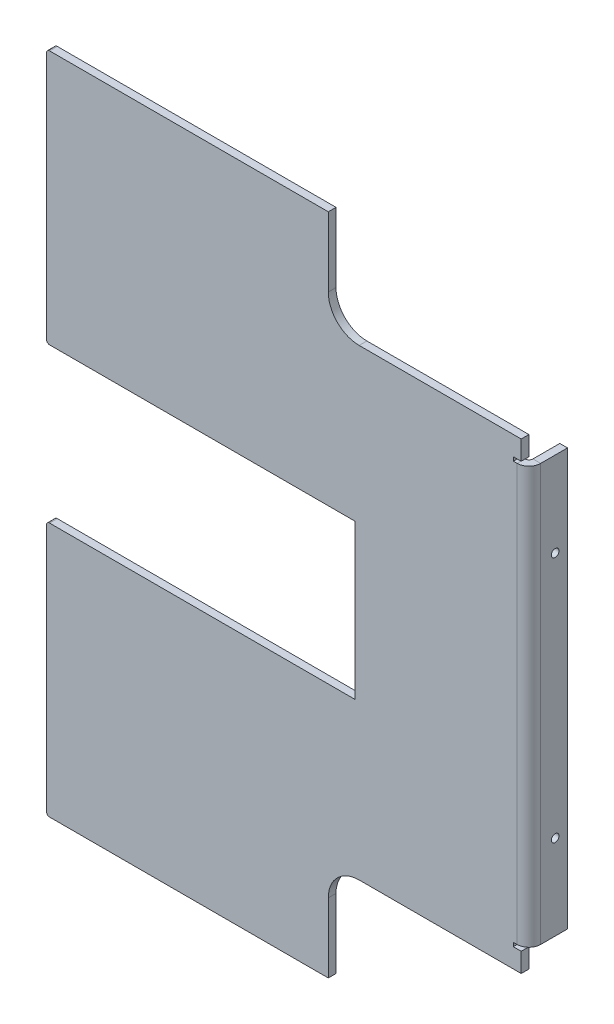
ISO-10303-21;
HEADER;
FILE_DESCRIPTION(('STEP AP214'),'2;1');
FILE_NAME('part.step','',(''),(''),'','','');
FILE_SCHEMA(('AUTOMOTIVE_DESIGN { 1 0 10303 214 1 1 1 1 }'));
ENDSEC;
DATA;
#1=APPLICATION_CONTEXT('core data for automotive mechanical design processes');
#2=APPLICATION_PROTOCOL_DEFINITION('international standard','automotive_design',2000,#1);
#3=PRODUCT_CONTEXT('',#1,'mechanical');
#4=PRODUCT('Part','Part','',(#3));
#5=PRODUCT_RELATED_PRODUCT_CATEGORY('part','',(#4));
#6=PRODUCT_DEFINITION_FORMATION('','',#4);
#7=PRODUCT_DEFINITION_CONTEXT('part definition',#1,'design');
#8=PRODUCT_DEFINITION('design','',#6,#7);
#9=PRODUCT_DEFINITION_SHAPE('','',#8);
#10=(LENGTH_UNIT() NAMED_UNIT(*) SI_UNIT(.MILLI.,.METRE.));
#11=(NAMED_UNIT(*) PLANE_ANGLE_UNIT() SI_UNIT($,.RADIAN.));
#12=(NAMED_UNIT(*) SI_UNIT($,.STERADIAN.) SOLID_ANGLE_UNIT());
#13=UNCERTAINTY_MEASURE_WITH_UNIT(LENGTH_MEASURE(1.E-05),#10,'distance_accuracy_value','');
#14=(GEOMETRIC_REPRESENTATION_CONTEXT(3) GLOBAL_UNCERTAINTY_ASSIGNED_CONTEXT((#13)) GLOBAL_UNIT_ASSIGNED_CONTEXT((#10,
#11,#12)) REPRESENTATION_CONTEXT('',''));
#15=CARTESIAN_POINT('',(0.,0.,0.));
#16=DIRECTION('',(0.,0.,1.));
#17=DIRECTION('',(1.,0.,0.));
#18=AXIS2_PLACEMENT_3D('',#15,#16,#17);
#19=CARTESIAN_POINT('',(153.8,150.,-5.));
#20=DIRECTION('',(1.,0.,0.));
#21=DIRECTION('',(0.,1.,0.));
#22=AXIS2_PLACEMENT_3D('',#19,#20,#21);
#23=PLANE('',#22);
#24=DIRECTION('',(0.,1.,0.));
#25=VECTOR('',#24,1.);
#26=CARTESIAN_POINT('',(153.8,150.,-5.));
#27=LINE('',#26,#25);
#28=CARTESIAN_POINT('',(153.8,-150.,-5.));
#29=VERTEX_POINT('',#28);
#30=CARTESIAN_POINT('',(153.8,-137.5,-5.));
#31=VERTEX_POINT('',#30);
#32=EDGE_CURVE('E356',#29,#31,#27,.T.);
#33=ORIENTED_EDGE('',*,*,#32,.T.);
#34=DIRECTION('',(0.,0.,1.));
#35=VECTOR('',#34,1.);
#36=CARTESIAN_POINT('',(153.8,-137.5,-5.00000000000001));
#37=LINE('',#36,#35);
#38=CARTESIAN_POINT('',(153.8,-137.5,0.));
#39=VERTEX_POINT('',#38);
#40=EDGE_CURVE('E313',#31,#39,#37,.T.);
#41=ORIENTED_EDGE('',*,*,#40,.T.);
#42=DIRECTION('',(0.,1.,0.));
#43=VECTOR('',#42,1.);
#44=CARTESIAN_POINT('',(153.8,150.,0.));
#45=LINE('',#44,#43);
#46=CARTESIAN_POINT('',(153.8,-150.,0.));
#47=VERTEX_POINT('',#46);
#48=EDGE_CURVE('E388',#47,#39,#45,.T.);
#49=ORIENTED_EDGE('',*,*,#48,.F.);
#50=DIRECTION('',(0.,0.,1.));
#51=VECTOR('',#50,1.);
#52=CARTESIAN_POINT('',(153.8,-150.,-5.));
#53=LINE('',#52,#51);
#54=EDGE_CURVE('E421',#29,#47,#53,.T.);
#55=ORIENTED_EDGE('',*,*,#54,.F.);
#56=EDGE_LOOP('',(#33,#41,#49,#55));
#57=FACE_BOUND('',#56,.T.);
#58=ADVANCED_FACE('F43',(#57),#23,.T.);
#59=CARTESIAN_POINT('',(153.8,137.5,0.));
#60=VERTEX_POINT('',#59);
#61=CARTESIAN_POINT('',(153.8,150.,0.));
#62=VERTEX_POINT('',#61);
#63=EDGE_CURVE('E387',#60,#62,#45,.T.);
#64=ORIENTED_EDGE('',*,*,#63,.F.);
#65=DIRECTION('',(0.,0.,1.));
#66=VECTOR('',#65,1.);
#67=CARTESIAN_POINT('',(153.8,137.5,-5.00000000000001));
#68=LINE('',#67,#66);
#69=CARTESIAN_POINT('',(153.8,137.5,-5.));
#70=VERTEX_POINT('',#69);
#71=EDGE_CURVE('E332',#70,#60,#68,.T.);
#72=ORIENTED_EDGE('',*,*,#71,.F.);
#73=CARTESIAN_POINT('',(153.8,150.,-5.));
#74=VERTEX_POINT('',#73);
#75=EDGE_CURVE('E355',#70,#74,#27,.T.);
#76=ORIENTED_EDGE('',*,*,#75,.T.);
#77=DIRECTION('',(0.,0.,1.));
#78=VECTOR('',#77,1.);
#79=CARTESIAN_POINT('',(153.8,150.,-5.));
#80=LINE('',#79,#78);
#81=EDGE_CURVE('E418',#74,#62,#80,.T.);
#82=ORIENTED_EDGE('',*,*,#81,.T.);
#83=EDGE_LOOP('',(#64,#72,#76,#82));
#84=FACE_BOUND('',#83,.T.);
#85=ADVANCED_FACE('F552',(#84),#23,.T.);
#86=CARTESIAN_POINT('',(0.,0.,-5.));
#87=DIRECTION('',(0.,0.,-1.));
#88=DIRECTION('',(-1.,0.,0.));
#89=AXIS2_PLACEMENT_3D('',#86,#87,#88);
#90=PLANE('',#89);
#91=DIRECTION('',(0.,-1.,0.));
#92=VECTOR('',#91,1.);
#93=CARTESIAN_POINT('',(-153.8,215.,-5.));
#94=LINE('',#93,#92);
#95=CARTESIAN_POINT('',(-153.8,213.,-5.));
#96=VERTEX_POINT('',#95);
#97=CARTESIAN_POINT('',(-153.8,51.9999999999999,-5.));
#98=VERTEX_POINT('',#97);
#99=EDGE_CURVE('E367',#96,#98,#94,.T.);
#100=ORIENTED_EDGE('',*,*,#99,.F.);
#101=CARTESIAN_POINT('',(-151.8,213.,-5.));
#102=DIRECTION('',(0.,0.,-1.));
#103=DIRECTION('',(-1.,0.,0.));
#104=AXIS2_PLACEMENT_3D('',#101,#102,#103);
#105=CIRCLE('',#104,2.);
#106=CARTESIAN_POINT('',(-151.8,215.,-5.));
#107=VERTEX_POINT('',#106);
#108=EDGE_CURVE('E490',#96,#107,#105,.T.);
#109=ORIENTED_EDGE('',*,*,#108,.T.);
#110=DIRECTION('',(-1.,0.,0.));
#111=VECTOR('',#110,1.);
#112=CARTESIAN_POINT('',(28.8,215.,-5.));
#113=LINE('',#112,#111);
#114=CARTESIAN_POINT('',(28.8,215.,-5.));
#115=VERTEX_POINT('',#114);
#116=EDGE_CURVE('E364',#115,#107,#113,.T.);
#117=ORIENTED_EDGE('',*,*,#116,.F.);
#118=DIRECTION('',(0.,1.,0.));
#119=VECTOR('',#118,1.);
#120=CARTESIAN_POINT('',(28.8,215.,-5.));
#121=LINE('',#120,#119);
#122=CARTESIAN_POINT('',(28.8,170.,-5.));
#123=VERTEX_POINT('',#122);
#124=EDGE_CURVE('E362',#123,#115,#121,.T.);
#125=ORIENTED_EDGE('',*,*,#124,.F.);
#126=CARTESIAN_POINT('',(48.8,170.,-5.));
#127=DIRECTION('',(0.,0.,-1.));
#128=DIRECTION('',(-1.,0.,0.));
#129=AXIS2_PLACEMENT_3D('',#126,#127,#128);
#130=CIRCLE('',#129,20.);
#131=CARTESIAN_POINT('',(48.8,150.,-5.));
#132=VERTEX_POINT('',#131);
#133=EDGE_CURVE('E463',#123,#132,#130,.F.);
#134=ORIENTED_EDGE('',*,*,#133,.T.);
#135=DIRECTION('',(-1.,0.,0.));
#136=VECTOR('',#135,1.);
#137=CARTESIAN_POINT('',(153.8,150.,-5.));
#138=LINE('',#137,#136);
#139=EDGE_CURVE('E359',#74,#132,#138,.T.);
#140=ORIENTED_EDGE('',*,*,#139,.F.);
#141=ORIENTED_EDGE('',*,*,#75,.F.);
#142=DIRECTION('',(1.,0.,0.));
#143=VECTOR('',#142,1.);
#144=CARTESIAN_POINT('',(148.7,137.5,-5.00000000000001));
#145=LINE('',#144,#143);
#146=CARTESIAN_POINT('',(148.7,137.5,-5.));
#147=VERTEX_POINT('',#146);
#148=EDGE_CURVE('E329',#147,#70,#145,.T.);
#149=ORIENTED_EDGE('',*,*,#148,.F.);
#150=DIRECTION('',(0.,1.,0.));
#151=VECTOR('',#150,1.);
#152=CARTESIAN_POINT('',(148.7,135.,-5.00000000000001));
#153=LINE('',#152,#151);
#154=CARTESIAN_POINT('',(148.7,135.,-5.));
#155=VERTEX_POINT('',#154);
#156=EDGE_CURVE('E325',#155,#147,#153,.T.);
#157=ORIENTED_EDGE('',*,*,#156,.F.);
#158=DIRECTION('',(-1.,0.,0.));
#159=VECTOR('',#158,1.);
#160=CARTESIAN_POINT('',(151.2,135.,-5.00000000000001));
#161=LINE('',#160,#159);
#162=CARTESIAN_POINT('',(151.2,135.,-5.));
#163=VERTEX_POINT('',#162);
#164=EDGE_CURVE('E322',#163,#155,#161,.T.);
#165=ORIENTED_EDGE('',*,*,#164,.F.);
#166=DIRECTION('',(0.,-1.,0.));
#167=VECTOR('',#166,1.);
#168=CARTESIAN_POINT('',(151.2,-135.,-5.00000000000001));
#169=LINE('',#168,#167);
#170=CARTESIAN_POINT('',(151.2,-135.,-5.));
#171=VERTEX_POINT('',#170);
#172=EDGE_CURVE('E300',#171,#163,#169,.F.);
#173=ORIENTED_EDGE('',*,*,#172,.F.);
#174=DIRECTION('',(1.,0.,0.));
#175=VECTOR('',#174,1.);
#176=CARTESIAN_POINT('',(148.7,-135.,-5.00000000000001));
#177=LINE('',#176,#175);
#178=CARTESIAN_POINT('',(148.7,-135.,-5.));
#179=VERTEX_POINT('',#178);
#180=EDGE_CURVE('E318',#179,#171,#177,.T.);
#181=ORIENTED_EDGE('',*,*,#180,.F.);
#182=DIRECTION('',(0.,1.,0.));
#183=VECTOR('',#182,1.);
#184=CARTESIAN_POINT('',(148.7,-137.5,-5.00000000000001));
#185=LINE('',#184,#183);
#186=CARTESIAN_POINT('',(148.7,-137.5,-5.));
#187=VERTEX_POINT('',#186);
#188=EDGE_CURVE('E314',#187,#179,#185,.T.);
#189=ORIENTED_EDGE('',*,*,#188,.F.);
#190=DIRECTION('',(-1.,0.,0.));
#191=VECTOR('',#190,1.);
#192=CARTESIAN_POINT('',(153.8,-137.5,-5.00000000000001));
#193=LINE('',#192,#191);
#194=EDGE_CURVE('E309',#31,#187,#193,.T.);
#195=ORIENTED_EDGE('',*,*,#194,.F.);
#196=ORIENTED_EDGE('',*,*,#32,.F.);
#197=DIRECTION('',(1.,0.,0.));
#198=VECTOR('',#197,1.);
#199=CARTESIAN_POINT('',(153.8,-150.,-5.));
#200=LINE('',#199,#198);
#201=CARTESIAN_POINT('',(48.8000000000001,-150.,-5.));
#202=VERTEX_POINT('',#201);
#203=EDGE_CURVE('E353',#202,#29,#200,.T.);
#204=ORIENTED_EDGE('',*,*,#203,.F.);
#205=CARTESIAN_POINT('',(48.8000000000001,-170.,-5.));
#206=DIRECTION('',(0.,0.,-1.));
#207=DIRECTION('',(-1.,0.,0.));
#208=AXIS2_PLACEMENT_3D('',#205,#206,#207);
#209=CIRCLE('',#208,20.);
#210=CARTESIAN_POINT('',(28.8,-170.,-5.));
#211=VERTEX_POINT('',#210);
#212=EDGE_CURVE('E467',#202,#211,#209,.F.);
#213=ORIENTED_EDGE('',*,*,#212,.T.);
#214=DIRECTION('',(0.,1.,0.));
#215=VECTOR('',#214,1.);
#216=CARTESIAN_POINT('',(28.8,-215.,-5.));
#217=LINE('',#216,#215);
#218=CARTESIAN_POINT('',(28.8,-215.,-5.));
#219=VERTEX_POINT('',#218);
#220=EDGE_CURVE('E350',#219,#211,#217,.T.);
#221=ORIENTED_EDGE('',*,*,#220,.F.);
#222=DIRECTION('',(1.,0.,0.));
#223=VECTOR('',#222,1.);
#224=CARTESIAN_POINT('',(28.8,-215.,-5.));
#225=LINE('',#224,#223);
#226=CARTESIAN_POINT('',(-151.8,-215.,-5.));
#227=VERTEX_POINT('',#226);
#228=EDGE_CURVE('E347',#227,#219,#225,.T.);
#229=ORIENTED_EDGE('',*,*,#228,.F.);
#230=CARTESIAN_POINT('',(-151.8,-213.,-5.));
#231=DIRECTION('',(0.,0.,-1.));
#232=DIRECTION('',(-1.,0.,0.));
#233=AXIS2_PLACEMENT_3D('',#230,#231,#232);
#234=CIRCLE('',#233,2.);
#235=CARTESIAN_POINT('',(-153.8,-213.,-5.));
#236=VERTEX_POINT('',#235);
#237=EDGE_CURVE('E485',#227,#236,#234,.T.);
#238=ORIENTED_EDGE('',*,*,#237,.T.);
#239=DIRECTION('',(0.,-1.,0.));
#240=VECTOR('',#239,1.);
#241=CARTESIAN_POINT('',(-153.8,-50.,-5.));
#242=LINE('',#241,#240);
#243=CARTESIAN_POINT('',(-153.8,-52.,-5.));
#244=VERTEX_POINT('',#243);
#245=EDGE_CURVE('E344',#244,#236,#242,.T.);
#246=ORIENTED_EDGE('',*,*,#245,.F.);
#247=CARTESIAN_POINT('',(-151.8,-52.,-5.));
#248=DIRECTION('',(0.,0.,-1.));
#249=DIRECTION('',(-1.,0.,0.));
#250=AXIS2_PLACEMENT_3D('',#247,#248,#249);
#251=CIRCLE('',#250,2.);
#252=CARTESIAN_POINT('',(-151.8,-50.,-5.));
#253=VERTEX_POINT('',#252);
#254=EDGE_CURVE('E66',#244,#253,#251,.T.);
#255=ORIENTED_EDGE('',*,*,#254,.T.);
#256=DIRECTION('',(-1.,0.,0.));
#257=VECTOR('',#256,1.);
#258=CARTESIAN_POINT('',(-153.8,-50.,-5.));
#259=LINE('',#258,#257);
#260=CARTESIAN_POINT('',(46.2,-50.,-5.));
#261=VERTEX_POINT('',#260);
#262=EDGE_CURVE('E375',#261,#253,#259,.T.);
#263=ORIENTED_EDGE('',*,*,#262,.F.);
#264=DIRECTION('',(0.,-1.,0.));
#265=VECTOR('',#264,1.);
#266=CARTESIAN_POINT('',(46.2,50.,-5.));
#267=LINE('',#266,#265);
#268=CARTESIAN_POINT('',(46.2,50.,-5.));
#269=VERTEX_POINT('',#268);
#270=EDGE_CURVE('E372',#269,#261,#267,.T.);
#271=ORIENTED_EDGE('',*,*,#270,.F.);
#272=DIRECTION('',(1.,0.,0.));
#273=VECTOR('',#272,1.);
#274=CARTESIAN_POINT('',(-153.8,49.9999999999999,-5.));
#275=LINE('',#274,#273);
#276=CARTESIAN_POINT('',(-151.8,49.9999999999999,-5.));
#277=VERTEX_POINT('',#276);
#278=EDGE_CURVE('E370',#277,#269,#275,.T.);
#279=ORIENTED_EDGE('',*,*,#278,.F.);
#280=CARTESIAN_POINT('',(-151.8,51.9999999999999,-5.));
#281=DIRECTION('',(0.,0.,-1.));
#282=DIRECTION('',(-1.,0.,0.));
#283=AXIS2_PLACEMENT_3D('',#280,#281,#282);
#284=CIRCLE('',#283,2.);
#285=EDGE_CURVE('E488',#277,#98,#284,.T.);
#286=ORIENTED_EDGE('',*,*,#285,.T.);
#287=EDGE_LOOP('',(#100,#109,#117,#125,#134,#140,#141,#149,#157,#165,#173,#181,#189,#195,#196,
#204,#213,#221,#229,#238,#246,#255,#263,#271,#279,#286));
#288=FACE_BOUND('',#287,.T.);
#289=ADVANCED_FACE('F505',(#288),#90,.T.);
#290=CARTESIAN_POINT('',(0.,0.,0.));
#291=DIRECTION('',(0.,0.,-1.));
#292=DIRECTION('',(-1.,0.,0.));
#293=AXIS2_PLACEMENT_3D('',#290,#291,#292);
#294=PLANE('',#293);
#295=DIRECTION('',(-1.,0.,0.));
#296=VECTOR('',#295,1.);
#297=CARTESIAN_POINT('',(28.8,215.,0.));
#298=LINE('',#297,#296);
#299=CARTESIAN_POINT('',(28.8,215.,0.));
#300=VERTEX_POINT('',#299);
#301=CARTESIAN_POINT('',(-151.8,215.,0.));
#302=VERTEX_POINT('',#301);
#303=EDGE_CURVE('E396',#300,#302,#298,.T.);
#304=ORIENTED_EDGE('',*,*,#303,.T.);
#305=CARTESIAN_POINT('',(-151.8,213.,0.));
#306=DIRECTION('',(0.,0.,-1.));
#307=DIRECTION('',(-1.,0.,0.));
#308=AXIS2_PLACEMENT_3D('',#305,#306,#307);
#309=CIRCLE('',#308,2.);
#310=CARTESIAN_POINT('',(-153.8,213.,0.));
#311=VERTEX_POINT('',#310);
#312=EDGE_CURVE('E478',#302,#311,#309,.F.);
#313=ORIENTED_EDGE('',*,*,#312,.T.);
#314=DIRECTION('',(0.,-1.,0.));
#315=VECTOR('',#314,1.);
#316=CARTESIAN_POINT('',(-153.8,215.,0.));
#317=LINE('',#316,#315);
#318=CARTESIAN_POINT('',(-153.8,51.9999999999999,0.));
#319=VERTEX_POINT('',#318);
#320=EDGE_CURVE('E399',#311,#319,#317,.T.);
#321=ORIENTED_EDGE('',*,*,#320,.T.);
#322=CARTESIAN_POINT('',(-151.8,51.9999999999999,0.));
#323=DIRECTION('',(0.,0.,-1.));
#324=DIRECTION('',(-1.,0.,0.));
#325=AXIS2_PLACEMENT_3D('',#322,#323,#324);
#326=CIRCLE('',#325,2.);
#327=CARTESIAN_POINT('',(-151.8,49.9999999999999,0.));
#328=VERTEX_POINT('',#327);
#329=EDGE_CURVE('E476',#319,#328,#326,.F.);
#330=ORIENTED_EDGE('',*,*,#329,.T.);
#331=DIRECTION('',(1.,0.,0.));
#332=VECTOR('',#331,1.);
#333=CARTESIAN_POINT('',(-153.8,49.9999999999999,0.));
#334=LINE('',#333,#332);
#335=CARTESIAN_POINT('',(46.2,50.,0.));
#336=VERTEX_POINT('',#335);
#337=EDGE_CURVE('E402',#328,#336,#334,.T.);
#338=ORIENTED_EDGE('',*,*,#337,.T.);
#339=DIRECTION('',(0.,-1.,0.));
#340=VECTOR('',#339,1.);
#341=CARTESIAN_POINT('',(46.2,50.,0.));
#342=LINE('',#341,#340);
#343=CARTESIAN_POINT('',(46.2,-50.,0.));
#344=VERTEX_POINT('',#343);
#345=EDGE_CURVE('E404',#336,#344,#342,.T.);
#346=ORIENTED_EDGE('',*,*,#345,.T.);
#347=DIRECTION('',(-1.,0.,0.));
#348=VECTOR('',#347,1.);
#349=CARTESIAN_POINT('',(-153.8,-50.,0.));
#350=LINE('',#349,#348);
#351=CARTESIAN_POINT('',(-151.8,-50.,0.));
#352=VERTEX_POINT('',#351);
#353=EDGE_CURVE('E348',#344,#352,#350,.T.);
#354=ORIENTED_EDGE('',*,*,#353,.T.);
#355=CARTESIAN_POINT('',(-151.8,-52.,0.));
#356=DIRECTION('',(0.,0.,-1.));
#357=DIRECTION('',(-1.,0.,0.));
#358=AXIS2_PLACEMENT_3D('',#355,#356,#357);
#359=CIRCLE('',#358,2.);
#360=CARTESIAN_POINT('',(-153.8,-52.,0.));
#361=VERTEX_POINT('',#360);
#362=EDGE_CURVE('E474',#352,#361,#359,.F.);
#363=ORIENTED_EDGE('',*,*,#362,.T.);
#364=DIRECTION('',(0.,-1.,0.));
#365=VECTOR('',#364,1.);
#366=CARTESIAN_POINT('',(-153.8,-50.,0.));
#367=LINE('',#366,#365);
#368=CARTESIAN_POINT('',(-153.8,-213.,0.));
#369=VERTEX_POINT('',#368);
#370=EDGE_CURVE('E312',#361,#369,#367,.T.);
#371=ORIENTED_EDGE('',*,*,#370,.T.);
#372=CARTESIAN_POINT('',(-151.8,-213.,0.));
#373=DIRECTION('',(0.,0.,-1.));
#374=DIRECTION('',(-1.,0.,0.));
#375=AXIS2_PLACEMENT_3D('',#372,#373,#374);
#376=CIRCLE('',#375,2.);
#377=CARTESIAN_POINT('',(-151.8,-215.,0.));
#378=VERTEX_POINT('',#377);
#379=EDGE_CURVE('E472',#369,#378,#376,.F.);
#380=ORIENTED_EDGE('',*,*,#379,.T.);
#381=DIRECTION('',(1.,0.,0.));
#382=VECTOR('',#381,1.);
#383=CARTESIAN_POINT('',(28.8,-215.,0.));
#384=LINE('',#383,#382);
#385=CARTESIAN_POINT('',(28.8,-215.,0.));
#386=VERTEX_POINT('',#385);
#387=EDGE_CURVE('E380',#378,#386,#384,.T.);
#388=ORIENTED_EDGE('',*,*,#387,.T.);
#389=DIRECTION('',(0.,1.,0.));
#390=VECTOR('',#389,1.);
#391=CARTESIAN_POINT('',(28.8,-215.,0.));
#392=LINE('',#391,#390);
#393=CARTESIAN_POINT('',(28.8,-170.,0.));
#394=VERTEX_POINT('',#393);
#395=EDGE_CURVE('E382',#386,#394,#392,.T.);
#396=ORIENTED_EDGE('',*,*,#395,.T.);
#397=CARTESIAN_POINT('',(48.8000000000001,-170.,0.));
#398=DIRECTION('',(0.,0.,-1.));
#399=DIRECTION('',(-1.,0.,0.));
#400=AXIS2_PLACEMENT_3D('',#397,#398,#399);
#401=CIRCLE('',#400,20.);
#402=CARTESIAN_POINT('',(48.8000000000001,-150.,0.));
#403=VERTEX_POINT('',#402);
#404=EDGE_CURVE('E465',#394,#403,#401,.T.);
#405=ORIENTED_EDGE('',*,*,#404,.T.);
#406=DIRECTION('',(1.,0.,0.));
#407=VECTOR('',#406,1.);
#408=CARTESIAN_POINT('',(153.8,-150.,0.));
#409=LINE('',#408,#407);
#410=EDGE_CURVE('E385',#403,#47,#409,.T.);
#411=ORIENTED_EDGE('',*,*,#410,.T.);
#412=ORIENTED_EDGE('',*,*,#48,.T.);
#413=DIRECTION('',(1.,0.,0.));
#414=VECTOR('',#413,1.);
#415=CARTESIAN_POINT('',(0.,-137.5,0.));
#416=LINE('',#415,#414);
#417=CARTESIAN_POINT('',(148.7,-137.5,0.));
#418=VERTEX_POINT('',#417);
#419=EDGE_CURVE('E440',#418,#39,#416,.T.);
#420=ORIENTED_EDGE('',*,*,#419,.F.);
#421=DIRECTION('',(0.,-1.,0.));
#422=VECTOR('',#421,1.);
#423=CARTESIAN_POINT('',(148.7,0.,0.));
#424=LINE('',#423,#422);
#425=CARTESIAN_POINT('',(148.7,-135.,0.));
#426=VERTEX_POINT('',#425);
#427=EDGE_CURVE('E437',#426,#418,#424,.T.);
#428=ORIENTED_EDGE('',*,*,#427,.F.);
#429=DIRECTION('',(-1.,0.,0.));
#430=VECTOR('',#429,1.);
#431=CARTESIAN_POINT('',(0.,-135.,0.));
#432=LINE('',#431,#430);
#433=CARTESIAN_POINT('',(151.2,-135.,0.));
#434=VERTEX_POINT('',#433);
#435=EDGE_CURVE('E434',#434,#426,#432,.T.);
#436=ORIENTED_EDGE('',*,*,#435,.F.);
#437=DIRECTION('',(0.,-1.,0.));
#438=VECTOR('',#437,1.);
#439=CARTESIAN_POINT('',(151.2,-135.,0.));
#440=LINE('',#439,#438);
#441=CARTESIAN_POINT('',(151.2,135.,0.));
#442=VERTEX_POINT('',#441);
#443=EDGE_CURVE('E249',#434,#442,#440,.F.);
#444=ORIENTED_EDGE('',*,*,#443,.T.);
#445=DIRECTION('',(1.,0.,0.));
#446=VECTOR('',#445,1.);
#447=CARTESIAN_POINT('',(0.,135.,0.));
#448=LINE('',#447,#446);
#449=CARTESIAN_POINT('',(148.7,135.,0.));
#450=VERTEX_POINT('',#449);
#451=EDGE_CURVE('E431',#450,#442,#448,.T.);
#452=ORIENTED_EDGE('',*,*,#451,.F.);
#453=DIRECTION('',(0.,-1.,0.));
#454=VECTOR('',#453,1.);
#455=CARTESIAN_POINT('',(148.7,0.,0.));
#456=LINE('',#455,#454);
#457=CARTESIAN_POINT('',(148.7,137.5,0.));
#458=VERTEX_POINT('',#457);
#459=EDGE_CURVE('E428',#458,#450,#456,.T.);
#460=ORIENTED_EDGE('',*,*,#459,.F.);
#461=DIRECTION('',(-1.,0.,0.));
#462=VECTOR('',#461,1.);
#463=CARTESIAN_POINT('',(0.,137.5,0.));
#464=LINE('',#463,#462);
#465=EDGE_CURVE('E411',#60,#458,#464,.T.);
#466=ORIENTED_EDGE('',*,*,#465,.F.);
#467=ORIENTED_EDGE('',*,*,#63,.T.);
#468=DIRECTION('',(-1.,0.,0.));
#469=VECTOR('',#468,1.);
#470=CARTESIAN_POINT('',(153.8,150.,0.));
#471=LINE('',#470,#469);
#472=CARTESIAN_POINT('',(48.8,150.,0.));
#473=VERTEX_POINT('',#472);
#474=EDGE_CURVE('E391',#62,#473,#471,.T.);
#475=ORIENTED_EDGE('',*,*,#474,.T.);
#476=CARTESIAN_POINT('',(48.8,170.,0.));
#477=DIRECTION('',(0.,0.,-1.));
#478=DIRECTION('',(-1.,0.,0.));
#479=AXIS2_PLACEMENT_3D('',#476,#477,#478);
#480=CIRCLE('',#479,20.);
#481=CARTESIAN_POINT('',(28.8,170.,0.));
#482=VERTEX_POINT('',#481);
#483=EDGE_CURVE('E461',#473,#482,#480,.T.);
#484=ORIENTED_EDGE('',*,*,#483,.T.);
#485=DIRECTION('',(0.,1.,0.));
#486=VECTOR('',#485,1.);
#487=CARTESIAN_POINT('',(28.8,215.,0.));
#488=LINE('',#487,#486);
#489=EDGE_CURVE('E394',#482,#300,#488,.T.);
#490=ORIENTED_EDGE('',*,*,#489,.T.);
#491=EDGE_LOOP('',(#304,#313,#321,#330,#338,#346,#354,#363,#371,#380,#388,#396,#405,#411,#412,
#420,#428,#436,#444,#452,#460,#466,#467,#475,#484,#490));
#492=FACE_BOUND('',#491,.T.);
#493=ADVANCED_FACE('F514',(#492),#294,.F.);
#494=CARTESIAN_POINT('',(-153.8,-50.,-5.));
#495=DIRECTION('',(-1.,0.,0.));
#496=DIRECTION('',(0.,-1.,0.));
#497=AXIS2_PLACEMENT_3D('',#494,#495,#496);
#498=PLANE('',#497);
#499=ORIENTED_EDGE('',*,*,#370,.F.);
#500=DIRECTION('',(0.,0.,1.));
#501=VECTOR('',#500,1.);
#502=CARTESIAN_POINT('',(-153.8,-52.,-5.));
#503=LINE('',#502,#501);
#504=EDGE_CURVE('E51',#361,#244,#503,.F.);
#505=ORIENTED_EDGE('',*,*,#504,.T.);
#506=ORIENTED_EDGE('',*,*,#245,.T.);
#507=DIRECTION('',(0.,0.,1.));
#508=VECTOR('',#507,1.);
#509=CARTESIAN_POINT('',(-153.8,-213.,-5.));
#510=LINE('',#509,#508);
#511=EDGE_CURVE('E496',#236,#369,#510,.T.);
#512=ORIENTED_EDGE('',*,*,#511,.T.);
#513=EDGE_LOOP('',(#499,#505,#506,#512));
#514=FACE_BOUND('',#513,.T.);
#515=ADVANCED_FACE('F501',(#514),#498,.T.);
#516=CARTESIAN_POINT('',(-153.8,-50.,-5.));
#517=DIRECTION('',(0.,1.,0.));
#518=DIRECTION('',(-1.,0.,0.));
#519=AXIS2_PLACEMENT_3D('',#516,#517,#518);
#520=PLANE('',#519);
#521=ORIENTED_EDGE('',*,*,#262,.T.);
#522=DIRECTION('',(0.,0.,1.));
#523=VECTOR('',#522,1.);
#524=CARTESIAN_POINT('',(-151.8,-50.,-5.));
#525=LINE('',#524,#523);
#526=EDGE_CURVE('E493',#253,#352,#525,.T.);
#527=ORIENTED_EDGE('',*,*,#526,.T.);
#528=ORIENTED_EDGE('',*,*,#353,.F.);
#529=DIRECTION('',(0.,0.,1.));
#530=VECTOR('',#529,1.);
#531=CARTESIAN_POINT('',(46.2,-50.,-5.));
#532=LINE('',#531,#530);
#533=EDGE_CURVE('E409',#261,#344,#532,.T.);
#534=ORIENTED_EDGE('',*,*,#533,.F.);
#535=EDGE_LOOP('',(#521,#527,#528,#534));
#536=FACE_BOUND('',#535,.T.);
#537=ADVANCED_FACE('F512',(#536),#520,.T.);
#538=CARTESIAN_POINT('',(46.2,50.,-5.));
#539=DIRECTION('',(-1.,0.,0.));
#540=DIRECTION('',(0.,-1.,0.));
#541=AXIS2_PLACEMENT_3D('',#538,#539,#540);
#542=PLANE('',#541);
#543=ORIENTED_EDGE('',*,*,#345,.F.);
#544=DIRECTION('',(0.,0.,1.));
#545=VECTOR('',#544,1.);
#546=CARTESIAN_POINT('',(46.2,50.,-5.));
#547=LINE('',#546,#545);
#548=EDGE_CURVE('E412',#269,#336,#547,.T.);
#549=ORIENTED_EDGE('',*,*,#548,.F.);
#550=ORIENTED_EDGE('',*,*,#270,.T.);
#551=ORIENTED_EDGE('',*,*,#533,.T.);
#552=EDGE_LOOP('',(#543,#549,#550,#551));
#553=FACE_BOUND('',#552,.T.);
#554=ADVANCED_FACE('F518',(#553),#542,.T.);
#555=CARTESIAN_POINT('',(-153.8,49.9999999999999,-5.));
#556=DIRECTION('',(0.,-1.,0.));
#557=DIRECTION('',(1.,0.,0.));
#558=AXIS2_PLACEMENT_3D('',#555,#556,#557);
#559=PLANE('',#558);
#560=ORIENTED_EDGE('',*,*,#337,.F.);
#561=DIRECTION('',(0.,0.,1.));
#562=VECTOR('',#561,1.);
#563=CARTESIAN_POINT('',(-151.8,49.9999999999999,-5.));
#564=LINE('',#563,#562);
#565=EDGE_CURVE('E58',#328,#277,#564,.F.);
#566=ORIENTED_EDGE('',*,*,#565,.T.);
#567=ORIENTED_EDGE('',*,*,#278,.T.);
#568=ORIENTED_EDGE('',*,*,#548,.T.);
#569=EDGE_LOOP('',(#560,#566,#567,#568));
#570=FACE_BOUND('',#569,.T.);
#571=ADVANCED_FACE('F684',(#570),#559,.T.);
#572=CARTESIAN_POINT('',(-153.8,215.,-5.));
#573=DIRECTION('',(-1.,0.,0.));
#574=DIRECTION('',(0.,-1.,0.));
#575=AXIS2_PLACEMENT_3D('',#572,#573,#574);
#576=PLANE('',#575);
#577=ORIENTED_EDGE('',*,*,#320,.F.);
#578=DIRECTION('',(0.,0.,1.));
#579=VECTOR('',#578,1.);
#580=CARTESIAN_POINT('',(-153.8,213.,-5.));
#581=LINE('',#580,#579);
#582=EDGE_CURVE('E483',#311,#96,#581,.F.);
#583=ORIENTED_EDGE('',*,*,#582,.T.);
#584=ORIENTED_EDGE('',*,*,#99,.T.);
#585=DIRECTION('',(0.,0.,1.));
#586=VECTOR('',#585,1.);
#587=CARTESIAN_POINT('',(-153.8,51.9999999999999,-5.));
#588=LINE('',#587,#586);
#589=EDGE_CURVE('E480',#98,#319,#588,.T.);
#590=ORIENTED_EDGE('',*,*,#589,.T.);
#591=EDGE_LOOP('',(#577,#583,#584,#590));
#592=FACE_BOUND('',#591,.T.);
#593=ADVANCED_FACE('F526',(#592),#576,.T.);
#594=CARTESIAN_POINT('',(28.8,215.,-5.));
#595=DIRECTION('',(0.,1.,0.));
#596=DIRECTION('',(-1.,0.,0.));
#597=AXIS2_PLACEMENT_3D('',#594,#595,#596);
#598=PLANE('',#597);
#599=ORIENTED_EDGE('',*,*,#116,.T.);
#600=DIRECTION('',(0.,0.,1.));
#601=VECTOR('',#600,1.);
#602=CARTESIAN_POINT('',(-151.8,215.,-5.));
#603=LINE('',#602,#601);
#604=EDGE_CURVE('E469',#107,#302,#603,.T.);
#605=ORIENTED_EDGE('',*,*,#604,.T.);
#606=ORIENTED_EDGE('',*,*,#303,.F.);
#607=DIRECTION('',(0.,0.,1.));
#608=VECTOR('',#607,1.);
#609=CARTESIAN_POINT('',(28.8,215.,-5.));
#610=LINE('',#609,#608);
#611=EDGE_CURVE('E415',#115,#300,#610,.T.);
#612=ORIENTED_EDGE('',*,*,#611,.F.);
#613=EDGE_LOOP('',(#599,#605,#606,#612));
#614=FACE_BOUND('',#613,.T.);
#615=ADVANCED_FACE('F534',(#614),#598,.T.);
#616=CARTESIAN_POINT('',(28.8,215.,-5.));
#617=DIRECTION('',(1.,0.,0.));
#618=DIRECTION('',(0.,1.,0.));
#619=AXIS2_PLACEMENT_3D('',#616,#617,#618);
#620=PLANE('',#619);
#621=ORIENTED_EDGE('',*,*,#489,.F.);
#622=DIRECTION('',(0.,0.,1.));
#623=VECTOR('',#622,1.);
#624=CARTESIAN_POINT('',(28.8,170.,-5.));
#625=LINE('',#624,#623);
#626=EDGE_CURVE('E454',#482,#123,#625,.F.);
#627=ORIENTED_EDGE('',*,*,#626,.T.);
#628=ORIENTED_EDGE('',*,*,#124,.T.);
#629=ORIENTED_EDGE('',*,*,#611,.T.);
#630=EDGE_LOOP('',(#621,#627,#628,#629));
#631=FACE_BOUND('',#630,.T.);
#632=ADVANCED_FACE('F690',(#631),#620,.T.);
#633=CARTESIAN_POINT('',(153.8,150.,-5.));
#634=DIRECTION('',(0.,1.,0.));
#635=DIRECTION('',(-1.,0.,0.));
#636=AXIS2_PLACEMENT_3D('',#633,#634,#635);
#637=PLANE('',#636);
#638=ORIENTED_EDGE('',*,*,#139,.T.);
#639=DIRECTION('',(0.,0.,1.));
#640=VECTOR('',#639,1.);
#641=CARTESIAN_POINT('',(48.8,150.,0.));
#642=LINE('',#641,#640);
#643=EDGE_CURVE('E443',#132,#473,#642,.T.);
#644=ORIENTED_EDGE('',*,*,#643,.T.);
#645=ORIENTED_EDGE('',*,*,#474,.F.);
#646=ORIENTED_EDGE('',*,*,#81,.F.);
#647=EDGE_LOOP('',(#638,#644,#645,#646));
#648=FACE_BOUND('',#647,.T.);
#649=ADVANCED_FACE('F547',(#648),#637,.T.);
#650=CARTESIAN_POINT('',(153.8,-150.,-5.));
#651=DIRECTION('',(0.,-1.,0.));
#652=DIRECTION('',(1.,0.,0.));
#653=AXIS2_PLACEMENT_3D('',#650,#651,#652);
#654=PLANE('',#653);
#655=ORIENTED_EDGE('',*,*,#410,.F.);
#656=DIRECTION('',(0.,0.,1.));
#657=VECTOR('',#656,1.);
#658=CARTESIAN_POINT('',(48.8000000000001,-150.,-5.));
#659=LINE('',#658,#657);
#660=EDGE_CURVE('E459',#403,#202,#659,.F.);
#661=ORIENTED_EDGE('',*,*,#660,.T.);
#662=ORIENTED_EDGE('',*,*,#203,.T.);
#663=ORIENTED_EDGE('',*,*,#54,.T.);
#664=EDGE_LOOP('',(#655,#661,#662,#663));
#665=FACE_BOUND('',#664,.T.);
#666=ADVANCED_FACE('F612',(#665),#654,.T.);
#667=CARTESIAN_POINT('',(28.8,-215.,-5.));
#668=DIRECTION('',(1.,0.,0.));
#669=DIRECTION('',(0.,0.,-1.));
#670=AXIS2_PLACEMENT_3D('',#667,#668,#669);
#671=PLANE('',#670);
#672=ORIENTED_EDGE('',*,*,#220,.T.);
#673=DIRECTION('',(0.,0.,1.));
#674=VECTOR('',#673,1.);
#675=CARTESIAN_POINT('',(28.8,-170.,0.));
#676=LINE('',#675,#674);
#677=EDGE_CURVE('E456',#211,#394,#676,.T.);
#678=ORIENTED_EDGE('',*,*,#677,.T.);
#679=ORIENTED_EDGE('',*,*,#395,.F.);
#680=DIRECTION('',(0.,0.,1.));
#681=VECTOR('',#680,1.);
#682=CARTESIAN_POINT('',(28.8,-215.,-5.));
#683=LINE('',#682,#681);
#684=EDGE_CURVE('E377',#219,#386,#683,.T.);
#685=ORIENTED_EDGE('',*,*,#684,.F.);
#686=EDGE_LOOP('',(#672,#678,#679,#685));
#687=FACE_BOUND('',#686,.T.);
#688=ADVANCED_FACE('F615',(#687),#671,.T.);
#689=CARTESIAN_POINT('',(28.8,-215.,-5.));
#690=DIRECTION('',(0.,-1.,0.));
#691=DIRECTION('',(1.,0.,0.));
#692=AXIS2_PLACEMENT_3D('',#689,#690,#691);
#693=PLANE('',#692);
#694=ORIENTED_EDGE('',*,*,#387,.F.);
#695=DIRECTION('',(0.,0.,1.));
#696=VECTOR('',#695,1.);
#697=CARTESIAN_POINT('',(-151.8,-215.,-5.));
#698=LINE('',#697,#696);
#699=EDGE_CURVE('E11',#378,#227,#698,.F.);
#700=ORIENTED_EDGE('',*,*,#699,.T.);
#701=ORIENTED_EDGE('',*,*,#228,.T.);
#702=ORIENTED_EDGE('',*,*,#684,.T.);
#703=EDGE_LOOP('',(#694,#700,#701,#702));
#704=FACE_BOUND('',#703,.T.);
#705=ADVANCED_FACE('F619',(#704),#693,.T.);
#706=CARTESIAN_POINT('',(153.8,-137.5,-5.00000000000001));
#707=DIRECTION('',(0.,1.,0.));
#708=DIRECTION('',(0.,0.,1.));
#709=AXIS2_PLACEMENT_3D('',#706,#707,#708);
#710=PLANE('',#709);
#711=DIRECTION('',(0.,0.,1.));
#712=VECTOR('',#711,1.);
#713=CARTESIAN_POINT('',(148.7,-137.5,-5.00000000000001));
#714=LINE('',#713,#712);
#715=EDGE_CURVE('E317',#187,#418,#714,.T.);
#716=ORIENTED_EDGE('',*,*,#715,.T.);
#717=ORIENTED_EDGE('',*,*,#419,.T.);
#718=ORIENTED_EDGE('',*,*,#40,.F.);
#719=ORIENTED_EDGE('',*,*,#194,.T.);
#720=EDGE_LOOP('',(#716,#717,#718,#719));
#721=FACE_BOUND('',#720,.T.);
#722=ADVANCED_FACE('F623',(#721),#710,.T.);
#723=CARTESIAN_POINT('',(148.7,-137.5,-5.00000000000001));
#724=DIRECTION('',(1.,0.,0.));
#725=DIRECTION('',(0.,0.,-1.));
#726=AXIS2_PLACEMENT_3D('',#723,#724,#725);
#727=PLANE('',#726);
#728=DIRECTION('',(0.,0.,1.));
#729=VECTOR('',#728,1.);
#730=CARTESIAN_POINT('',(148.7,-135.,-5.00000000000001));
#731=LINE('',#730,#729);
#732=EDGE_CURVE('E321',#179,#426,#731,.T.);
#733=ORIENTED_EDGE('',*,*,#732,.T.);
#734=ORIENTED_EDGE('',*,*,#427,.T.);
#735=ORIENTED_EDGE('',*,*,#715,.F.);
#736=ORIENTED_EDGE('',*,*,#188,.T.);
#737=EDGE_LOOP('',(#733,#734,#735,#736));
#738=FACE_BOUND('',#737,.T.);
#739=ADVANCED_FACE('F660',(#738),#727,.T.);
#740=CARTESIAN_POINT('',(148.7,-135.,-5.00000000000001));
#741=DIRECTION('',(0.,-1.,0.));
#742=DIRECTION('',(0.,0.,-1.));
#743=AXIS2_PLACEMENT_3D('',#740,#741,#742);
#744=PLANE('',#743);
#745=DIRECTION('',(0.,0.,1.));
#746=VECTOR('',#745,1.);
#747=CARTESIAN_POINT('',(151.2,-135.,-5.00000000000001));
#748=LINE('',#747,#746);
#749=EDGE_CURVE('E296',#171,#434,#748,.T.);
#750=ORIENTED_EDGE('',*,*,#749,.T.);
#751=ORIENTED_EDGE('',*,*,#435,.T.);
#752=ORIENTED_EDGE('',*,*,#732,.F.);
#753=ORIENTED_EDGE('',*,*,#180,.T.);
#754=EDGE_LOOP('',(#750,#751,#752,#753));
#755=FACE_BOUND('',#754,.T.);
#756=ADVANCED_FACE('F664',(#755),#744,.T.);
#757=CARTESIAN_POINT('',(151.2,135.,-5.00000000000001));
#758=DIRECTION('',(0.,1.,0.));
#759=DIRECTION('',(0.,0.,1.));
#760=AXIS2_PLACEMENT_3D('',#757,#758,#759);
#761=PLANE('',#760);
#762=DIRECTION('',(0.,0.,1.));
#763=VECTOR('',#762,1.);
#764=CARTESIAN_POINT('',(148.7,135.,-5.00000000000001));
#765=LINE('',#764,#763);
#766=EDGE_CURVE('E328',#155,#450,#765,.T.);
#767=ORIENTED_EDGE('',*,*,#766,.T.);
#768=ORIENTED_EDGE('',*,*,#451,.T.);
#769=DIRECTION('',(0.,0.,1.));
#770=VECTOR('',#769,1.);
#771=CARTESIAN_POINT('',(151.2,135.,-5.00000000000001));
#772=LINE('',#771,#770);
#773=EDGE_CURVE('E304',#163,#442,#772,.T.);
#774=ORIENTED_EDGE('',*,*,#773,.F.);
#775=ORIENTED_EDGE('',*,*,#164,.T.);
#776=EDGE_LOOP('',(#767,#768,#774,#775));
#777=FACE_BOUND('',#776,.T.);
#778=ADVANCED_FACE('F562',(#777),#761,.T.);
#779=CARTESIAN_POINT('',(148.7,135.,-5.00000000000001));
#780=DIRECTION('',(1.,0.,0.));
#781=DIRECTION('',(0.,0.,-1.));
#782=AXIS2_PLACEMENT_3D('',#779,#780,#781);
#783=PLANE('',#782);
#784=DIRECTION('',(0.,0.,1.));
#785=VECTOR('',#784,1.);
#786=CARTESIAN_POINT('',(148.7,137.5,-5.00000000000001));
#787=LINE('',#786,#785);
#788=EDGE_CURVE('E307',#147,#458,#787,.T.);
#789=ORIENTED_EDGE('',*,*,#788,.T.);
#790=ORIENTED_EDGE('',*,*,#459,.T.);
#791=ORIENTED_EDGE('',*,*,#766,.F.);
#792=ORIENTED_EDGE('',*,*,#156,.T.);
#793=EDGE_LOOP('',(#789,#790,#791,#792));
#794=FACE_BOUND('',#793,.T.);
#795=ADVANCED_FACE('F559',(#794),#783,.T.);
#796=CARTESIAN_POINT('',(148.7,137.5,-5.00000000000001));
#797=DIRECTION('',(0.,-1.,0.));
#798=DIRECTION('',(0.,0.,-1.));
#799=AXIS2_PLACEMENT_3D('',#796,#797,#798);
#800=PLANE('',#799);
#801=ORIENTED_EDGE('',*,*,#71,.T.);
#802=ORIENTED_EDGE('',*,*,#465,.T.);
#803=ORIENTED_EDGE('',*,*,#788,.F.);
#804=ORIENTED_EDGE('',*,*,#148,.T.);
#805=EDGE_LOOP('',(#801,#802,#803,#804));
#806=FACE_BOUND('',#805,.T.);
#807=ADVANCED_FACE('F556',(#806),#800,.T.);
#808=CARTESIAN_POINT('',(151.2,135.,-7.6));
#809=DIRECTION('',(0.,1.,0.));
#810=DIRECTION('',(0.,0.,1.));
#811=AXIS2_PLACEMENT_3D('',#808,#809,#810);
#812=PLANE('',#811);
#813=DIRECTION('',(1.,0.,0.));
#814=VECTOR('',#813,1.);
#815=CARTESIAN_POINT('',(153.8,135.,-7.6));
#816=LINE('',#815,#814);
#817=CARTESIAN_POINT('',(153.8,135.,-7.6));
#818=VERTEX_POINT('',#817);
#819=CARTESIAN_POINT('',(158.8,135.,-7.59999999999998));
#820=VERTEX_POINT('',#819);
#821=EDGE_CURVE('E451',#818,#820,#816,.T.);
#822=ORIENTED_EDGE('',*,*,#821,.F.);
#823=CARTESIAN_POINT('',(151.2,135.,-7.6));
#824=DIRECTION('',(0.,-1.,0.));
#825=DIRECTION('',(0.,0.,-1.));
#826=AXIS2_PLACEMENT_3D('',#823,#824,#825);
#827=CIRCLE('',#826,2.59999999999999);
#828=EDGE_CURVE('E252',#163,#818,#827,.F.);
#829=ORIENTED_EDGE('',*,*,#828,.F.);
#830=ORIENTED_EDGE('',*,*,#773,.T.);
#831=CARTESIAN_POINT('',(151.2,135.,-7.6));
#832=DIRECTION('',(0.,-1.,0.));
#833=DIRECTION('',(0.,0.,-1.));
#834=AXIS2_PLACEMENT_3D('',#831,#832,#833);
#835=CIRCLE('',#834,7.59999999999999);
#836=EDGE_CURVE('E295',#442,#820,#835,.F.);
#837=ORIENTED_EDGE('',*,*,#836,.T.);
#838=EDGE_LOOP('',(#822,#829,#830,#837));
#839=FACE_BOUND('',#838,.T.);
#840=ADVANCED_FACE('F568',(#839),#812,.T.);
#841=CARTESIAN_POINT('',(151.2,-135.,-7.6));
#842=DIRECTION('',(0.,1.,0.));
#843=DIRECTION('',(0.,0.,1.));
#844=AXIS2_PLACEMENT_3D('',#841,#842,#843);
#845=PLANE('',#844);
#846=CARTESIAN_POINT('',(151.2,-135.,-7.6));
#847=DIRECTION('',(0.,-1.,0.));
#848=DIRECTION('',(0.,0.,-1.));
#849=AXIS2_PLACEMENT_3D('',#846,#847,#848);
#850=CIRCLE('',#849,2.59999999999999);
#851=CARTESIAN_POINT('',(153.8,-135.,-7.6));
#852=VERTEX_POINT('',#851);
#853=EDGE_CURVE('E259',#852,#171,#850,.T.);
#854=ORIENTED_EDGE('',*,*,#853,.F.);
#855=DIRECTION('',(1.,0.,0.));
#856=VECTOR('',#855,1.);
#857=CARTESIAN_POINT('',(153.8,-135.,-7.6));
#858=LINE('',#857,#856);
#859=CARTESIAN_POINT('',(158.8,-135.,-7.59999999999998));
#860=VERTEX_POINT('',#859);
#861=EDGE_CURVE('E256',#852,#860,#858,.T.);
#862=ORIENTED_EDGE('',*,*,#861,.T.);
#863=CARTESIAN_POINT('',(151.2,-135.,-7.6));
#864=DIRECTION('',(0.,-1.,0.));
#865=DIRECTION('',(0.,0.,-1.));
#866=AXIS2_PLACEMENT_3D('',#863,#864,#865);
#867=CIRCLE('',#866,7.59999999999999);
#868=EDGE_CURVE('E242',#860,#434,#867,.T.);
#869=ORIENTED_EDGE('',*,*,#868,.T.);
#870=ORIENTED_EDGE('',*,*,#749,.F.);
#871=EDGE_LOOP('',(#854,#862,#869,#870));
#872=FACE_BOUND('',#871,.T.);
#873=ADVANCED_FACE('F257',(#872),#845,.F.);
#874=CARTESIAN_POINT('',(151.2,-135.,-7.6));
#875=DIRECTION('',(0.,-1.,0.));
#876=DIRECTION('',(1.,0.,0.));
#877=AXIS2_PLACEMENT_3D('',#874,#875,#876);
#878=CYLINDRICAL_SURFACE('',#877,7.59999999999999);
#879=ORIENTED_EDGE('',*,*,#443,.F.);
#880=ORIENTED_EDGE('',*,*,#868,.F.);
#881=DIRECTION('',(0.,1.,0.));
#882=VECTOR('',#881,1.);
#883=CARTESIAN_POINT('',(158.8,0.,-7.59999999999998));
#884=LINE('',#883,#882);
#885=EDGE_CURVE('E247',#860,#820,#884,.T.);
#886=ORIENTED_EDGE('',*,*,#885,.T.);
#887=ORIENTED_EDGE('',*,*,#836,.F.);
#888=EDGE_LOOP('',(#879,#880,#886,#887));
#889=FACE_BOUND('',#888,.T.);
#890=ADVANCED_FACE('F244',(#889),#878,.T.);
#891=CARTESIAN_POINT('',(151.2,-135.,-7.6));
#892=DIRECTION('',(0.,-1.,0.));
#893=DIRECTION('',(1.,0.,0.));
#894=AXIS2_PLACEMENT_3D('',#891,#892,#893);
#895=CYLINDRICAL_SURFACE('',#894,2.59999999999999);
#896=ORIENTED_EDGE('',*,*,#172,.T.);
#897=ORIENTED_EDGE('',*,*,#828,.T.);
#898=DIRECTION('',(0.,-1.,0.));
#899=VECTOR('',#898,1.);
#900=CARTESIAN_POINT('',(153.8,135.,-7.6));
#901=LINE('',#900,#899);
#902=EDGE_CURVE('E263',#818,#852,#901,.T.);
#903=ORIENTED_EDGE('',*,*,#902,.T.);
#904=ORIENTED_EDGE('',*,*,#853,.T.);
#905=EDGE_LOOP('',(#896,#897,#903,#904));
#906=FACE_BOUND('',#905,.T.);
#907=ADVANCED_FACE('F566',(#906),#895,.F.);
#908=CARTESIAN_POINT('',(158.8,-135.,-25.));
#909=DIRECTION('',(0.,1.,0.));
#910=DIRECTION('',(-1.,0.,0.));
#911=AXIS2_PLACEMENT_3D('',#908,#909,#910);
#912=PLANE('',#911);
#913=ORIENTED_EDGE('',*,*,#861,.F.);
#914=DIRECTION('',(0.,0.,-1.));
#915=VECTOR('',#914,1.);
#916=CARTESIAN_POINT('',(153.8,-135.,-25.0000000000001));
#917=LINE('',#916,#915);
#918=CARTESIAN_POINT('',(153.8,-135.,-25.0000000000001));
#919=VERTEX_POINT('',#918);
#920=EDGE_CURVE('E272',#852,#919,#917,.T.);
#921=ORIENTED_EDGE('',*,*,#920,.T.);
#922=DIRECTION('',(-1.,0.,0.));
#923=VECTOR('',#922,1.);
#924=CARTESIAN_POINT('',(158.8,-135.,-25.));
#925=LINE('',#924,#923);
#926=CARTESIAN_POINT('',(158.8,-135.,-25.));
#927=VERTEX_POINT('',#926);
#928=EDGE_CURVE('E276',#927,#919,#925,.T.);
#929=ORIENTED_EDGE('',*,*,#928,.F.);
#930=DIRECTION('',(0.,0.,-1.));
#931=VECTOR('',#930,1.);
#932=CARTESIAN_POINT('',(158.8,-135.,-25.));
#933=LINE('',#932,#931);
#934=EDGE_CURVE('E268',#860,#927,#933,.T.);
#935=ORIENTED_EDGE('',*,*,#934,.F.);
#936=EDGE_LOOP('',(#913,#921,#929,#935));
#937=FACE_BOUND('',#936,.T.);
#938=ADVANCED_FACE('F274',(#937),#912,.F.);
#939=CARTESIAN_POINT('',(158.8,135.,-4.99999999999998));
#940=DIRECTION('',(0.,-1.,0.));
#941=DIRECTION('',(1.,0.,0.));
#942=AXIS2_PLACEMENT_3D('',#939,#940,#941);
#943=PLANE('',#942);
#944=ORIENTED_EDGE('',*,*,#821,.T.);
#945=DIRECTION('',(0.,0.,1.));
#946=VECTOR('',#945,1.);
#947=CARTESIAN_POINT('',(158.8,135.,-4.99999999999998));
#948=LINE('',#947,#946);
#949=CARTESIAN_POINT('',(158.8,135.,-25.));
#950=VERTEX_POINT('',#949);
#951=EDGE_CURVE('E271',#950,#820,#948,.T.);
#952=ORIENTED_EDGE('',*,*,#951,.F.);
#953=DIRECTION('',(-1.,0.,0.));
#954=VECTOR('',#953,1.);
#955=CARTESIAN_POINT('',(158.8,135.,-25.));
#956=LINE('',#955,#954);
#957=CARTESIAN_POINT('',(153.8,135.,-25.0000000000001));
#958=VERTEX_POINT('',#957);
#959=EDGE_CURVE('E288',#950,#958,#956,.T.);
#960=ORIENTED_EDGE('',*,*,#959,.T.);
#961=DIRECTION('',(0.,0.,1.));
#962=VECTOR('',#961,1.);
#963=CARTESIAN_POINT('',(153.8,135.,-5.));
#964=LINE('',#963,#962);
#965=EDGE_CURVE('E279',#958,#818,#964,.T.);
#966=ORIENTED_EDGE('',*,*,#965,.T.);
#967=EDGE_LOOP('',(#944,#952,#960,#966));
#968=FACE_BOUND('',#967,.T.);
#969=ADVANCED_FACE('F584',(#968),#943,.F.);
#970=CARTESIAN_POINT('',(158.8,0.,4.44338159662587E-13));
#971=DIRECTION('',(-1.,0.,0.));
#972=DIRECTION('',(0.,0.,1.));
#973=AXIS2_PLACEMENT_3D('',#970,#971,#972);
#974=PLANE('',#973);
#975=CARTESIAN_POINT('',(158.8,80.,-17.));
#976=DIRECTION('',(1.,0.,0.));
#977=DIRECTION('',(0.,0.,-1.));
#978=AXIS2_PLACEMENT_3D('',#975,#976,#977);
#979=CIRCLE('',#978,2.5);
#980=CARTESIAN_POINT('',(158.8,80.,-19.5));
#981=VERTEX_POINT('',#980);
#982=EDGE_CURVE('E448',#981,#981,#979,.T.);
#983=ORIENTED_EDGE('',*,*,#982,.F.);
#984=EDGE_LOOP('',(#983));
#985=FACE_BOUND('',#984,.T.);
#986=CARTESIAN_POINT('',(158.8,-80.,-17.));
#987=DIRECTION('',(1.,0.,0.));
#988=DIRECTION('',(0.,0.,-1.));
#989=AXIS2_PLACEMENT_3D('',#986,#987,#988);
#990=CIRCLE('',#989,2.5);
#991=CARTESIAN_POINT('',(158.8,-80.,-19.5));
#992=VERTEX_POINT('',#991);
#993=EDGE_CURVE('E573',#992,#992,#990,.T.);
#994=ORIENTED_EDGE('',*,*,#993,.F.);
#995=EDGE_LOOP('',(#994));
#996=FACE_BOUND('',#995,.T.);
#997=ORIENTED_EDGE('',*,*,#885,.F.);
#998=ORIENTED_EDGE('',*,*,#934,.T.);
#999=DIRECTION('',(0.,1.,0.));
#1000=VECTOR('',#999,1.);
#1001=CARTESIAN_POINT('',(158.8,135.,-25.));
#1002=LINE('',#1001,#1000);
#1003=EDGE_CURVE('E278',#927,#950,#1002,.T.);
#1004=ORIENTED_EDGE('',*,*,#1003,.T.);
#1005=ORIENTED_EDGE('',*,*,#951,.T.);
#1006=EDGE_LOOP('',(#997,#998,#1004,#1005));
#1007=FACE_BOUND('',#1006,.T.);
#1008=ADVANCED_FACE('F267',(#985,#996,#1007),#974,.F.);
#1009=CARTESIAN_POINT('',(153.8,0.,4.26880752968371E-13));
#1010=DIRECTION('',(-1.,0.,0.));
#1011=DIRECTION('',(0.,0.,1.));
#1012=AXIS2_PLACEMENT_3D('',#1009,#1010,#1011);
#1013=PLANE('',#1012);
#1014=CARTESIAN_POINT('',(153.8,80.,-17.0000000000001));
#1015=DIRECTION('',(-1.,0.,0.));
#1016=DIRECTION('',(0.,0.,1.));
#1017=AXIS2_PLACEMENT_3D('',#1014,#1015,#1016);
#1018=CIRCLE('',#1017,2.5);
#1019=CARTESIAN_POINT('',(153.8,80.,-14.5000000000001));
#1020=VERTEX_POINT('',#1019);
#1021=EDGE_CURVE('E447',#1020,#1020,#1018,.T.);
#1022=ORIENTED_EDGE('',*,*,#1021,.F.);
#1023=EDGE_LOOP('',(#1022));
#1024=FACE_BOUND('',#1023,.T.);
#1025=CARTESIAN_POINT('',(153.8,-80.,-17.0000000000001));
#1026=DIRECTION('',(-1.,0.,0.));
#1027=DIRECTION('',(0.,0.,1.));
#1028=AXIS2_PLACEMENT_3D('',#1025,#1026,#1027);
#1029=CIRCLE('',#1028,2.5);
#1030=CARTESIAN_POINT('',(153.8,-80.,-14.5000000000001));
#1031=VERTEX_POINT('',#1030);
#1032=EDGE_CURVE('E444',#1031,#1031,#1029,.T.);
#1033=ORIENTED_EDGE('',*,*,#1032,.F.);
#1034=EDGE_LOOP('',(#1033));
#1035=FACE_BOUND('',#1034,.T.);
#1036=ORIENTED_EDGE('',*,*,#920,.F.);
#1037=ORIENTED_EDGE('',*,*,#902,.F.);
#1038=ORIENTED_EDGE('',*,*,#965,.F.);
#1039=DIRECTION('',(0.,1.,0.));
#1040=VECTOR('',#1039,1.);
#1041=CARTESIAN_POINT('',(153.8,135.,-25.0000000000001));
#1042=LINE('',#1041,#1040);
#1043=EDGE_CURVE('E283',#919,#958,#1042,.T.);
#1044=ORIENTED_EDGE('',*,*,#1043,.F.);
#1045=EDGE_LOOP('',(#1036,#1037,#1038,#1044));
#1046=FACE_BOUND('',#1045,.T.);
#1047=ADVANCED_FACE('F583',(#1024,#1035,#1046),#1013,.T.);
#1048=CARTESIAN_POINT('',(158.8,135.,-25.));
#1049=DIRECTION('',(0.,0.,1.));
#1050=DIRECTION('',(1.,0.,0.));
#1051=AXIS2_PLACEMENT_3D('',#1048,#1049,#1050);
#1052=PLANE('',#1051);
#1053=ORIENTED_EDGE('',*,*,#1043,.T.);
#1054=ORIENTED_EDGE('',*,*,#959,.F.);
#1055=ORIENTED_EDGE('',*,*,#1003,.F.);
#1056=ORIENTED_EDGE('',*,*,#928,.T.);
#1057=EDGE_LOOP('',(#1053,#1054,#1055,#1056));
#1058=FACE_BOUND('',#1057,.T.);
#1059=ADVANCED_FACE('F590',(#1058),#1052,.F.);
#1060=CARTESIAN_POINT('',(148.8,-80.,-17.0000000000001));
#1061=DIRECTION('',(1.,0.,0.));
#1062=DIRECTION('',(0.,0.,-1.));
#1063=AXIS2_PLACEMENT_3D('',#1060,#1061,#1062);
#1064=CYLINDRICAL_SURFACE('',#1063,2.5);
#1065=ORIENTED_EDGE('',*,*,#1032,.T.);
#1066=EDGE_LOOP('',(#1065));
#1067=FACE_BOUND('',#1066,.T.);
#1068=ORIENTED_EDGE('',*,*,#993,.T.);
#1069=EDGE_LOOP('',(#1068));
#1070=FACE_BOUND('',#1069,.T.);
#1071=ADVANCED_FACE('F588',(#1067,#1070),#1064,.F.);
#1072=CARTESIAN_POINT('',(148.8,80.,-17.0000000000001));
#1073=DIRECTION('',(1.,0.,0.));
#1074=DIRECTION('',(0.,0.,-1.));
#1075=AXIS2_PLACEMENT_3D('',#1072,#1073,#1074);
#1076=CYLINDRICAL_SURFACE('',#1075,2.5);
#1077=ORIENTED_EDGE('',*,*,#1021,.T.);
#1078=EDGE_LOOP('',(#1077));
#1079=FACE_BOUND('',#1078,.T.);
#1080=ORIENTED_EDGE('',*,*,#982,.T.);
#1081=EDGE_LOOP('',(#1080));
#1082=FACE_BOUND('',#1081,.T.);
#1083=ADVANCED_FACE('F579',(#1079,#1082),#1076,.F.);
#1084=CARTESIAN_POINT('',(48.8,170.,-5.));
#1085=DIRECTION('',(0.,0.,-1.));
#1086=DIRECTION('',(-1.,0.,0.));
#1087=AXIS2_PLACEMENT_3D('',#1084,#1085,#1086);
#1088=CYLINDRICAL_SURFACE('',#1087,20.);
#1089=ORIENTED_EDGE('',*,*,#133,.F.);
#1090=ORIENTED_EDGE('',*,*,#626,.F.);
#1091=ORIENTED_EDGE('',*,*,#483,.F.);
#1092=ORIENTED_EDGE('',*,*,#643,.F.);
#1093=EDGE_LOOP('',(#1089,#1090,#1091,#1092));
#1094=FACE_BOUND('',#1093,.T.);
#1095=ADVANCED_FACE('F544',(#1094),#1088,.F.);
#1096=CARTESIAN_POINT('',(48.8000000000001,-170.,-5.));
#1097=DIRECTION('',(0.,0.,-1.));
#1098=DIRECTION('',(-1.,0.,0.));
#1099=AXIS2_PLACEMENT_3D('',#1096,#1097,#1098);
#1100=CYLINDRICAL_SURFACE('',#1099,20.);
#1101=ORIENTED_EDGE('',*,*,#212,.F.);
#1102=ORIENTED_EDGE('',*,*,#660,.F.);
#1103=ORIENTED_EDGE('',*,*,#404,.F.);
#1104=ORIENTED_EDGE('',*,*,#677,.F.);
#1105=EDGE_LOOP('',(#1101,#1102,#1103,#1104));
#1106=FACE_BOUND('',#1105,.T.);
#1107=ADVANCED_FACE('F629',(#1106),#1100,.F.);
#1108=CARTESIAN_POINT('',(-151.8,213.,-5.));
#1109=DIRECTION('',(0.,0.,1.));
#1110=DIRECTION('',(1.,0.,0.));
#1111=AXIS2_PLACEMENT_3D('',#1108,#1109,#1110);
#1112=CYLINDRICAL_SURFACE('',#1111,2.);
#1113=ORIENTED_EDGE('',*,*,#108,.F.);
#1114=ORIENTED_EDGE('',*,*,#582,.F.);
#1115=ORIENTED_EDGE('',*,*,#312,.F.);
#1116=ORIENTED_EDGE('',*,*,#604,.F.);
#1117=EDGE_LOOP('',(#1113,#1114,#1115,#1116));
#1118=FACE_BOUND('',#1117,.T.);
#1119=ADVANCED_FACE('F532',(#1118),#1112,.T.);
#1120=CARTESIAN_POINT('',(-151.8,51.9999999999999,-5.));
#1121=DIRECTION('',(0.,0.,1.));
#1122=DIRECTION('',(1.,0.,0.));
#1123=AXIS2_PLACEMENT_3D('',#1120,#1121,#1122);
#1124=CYLINDRICAL_SURFACE('',#1123,2.);
#1125=ORIENTED_EDGE('',*,*,#285,.F.);
#1126=ORIENTED_EDGE('',*,*,#565,.F.);
#1127=ORIENTED_EDGE('',*,*,#329,.F.);
#1128=ORIENTED_EDGE('',*,*,#589,.F.);
#1129=EDGE_LOOP('',(#1125,#1126,#1127,#1128));
#1130=FACE_BOUND('',#1129,.T.);
#1131=ADVANCED_FACE('F523',(#1130),#1124,.T.);
#1132=CARTESIAN_POINT('',(-151.8,-52.,-5.));
#1133=DIRECTION('',(0.,0.,1.));
#1134=DIRECTION('',(1.,0.,0.));
#1135=AXIS2_PLACEMENT_3D('',#1132,#1133,#1134);
#1136=CYLINDRICAL_SURFACE('',#1135,2.);
#1137=ORIENTED_EDGE('',*,*,#254,.F.);
#1138=ORIENTED_EDGE('',*,*,#504,.F.);
#1139=ORIENTED_EDGE('',*,*,#362,.F.);
#1140=ORIENTED_EDGE('',*,*,#526,.F.);
#1141=EDGE_LOOP('',(#1137,#1138,#1139,#1140));
#1142=FACE_BOUND('',#1141,.T.);
#1143=ADVANCED_FACE('F509',(#1142),#1136,.T.);
#1144=CARTESIAN_POINT('',(-151.8,-213.,-5.));
#1145=DIRECTION('',(0.,0.,1.));
#1146=DIRECTION('',(1.,0.,0.));
#1147=AXIS2_PLACEMENT_3D('',#1144,#1145,#1146);
#1148=CYLINDRICAL_SURFACE('',#1147,2.);
#1149=ORIENTED_EDGE('',*,*,#237,.F.);
#1150=ORIENTED_EDGE('',*,*,#699,.F.);
#1151=ORIENTED_EDGE('',*,*,#379,.F.);
#1152=ORIENTED_EDGE('',*,*,#511,.F.);
#1153=EDGE_LOOP('',(#1149,#1150,#1151,#1152));
#1154=FACE_BOUND('',#1153,.T.);
#1155=ADVANCED_FACE('F45',(#1154),#1148,.T.);
#1156=CLOSED_SHELL('',(#58,#85,#289,#493,#515,#537,#554,#571,#593,#615,#632,#649,#666,#688,#705,
#722,#739,#756,#778,#795,#807,#840,#873,#890,#907,#938,#969,#1008,#1047,#1059,#1071,#1083,#1095,
#1107,#1119,#1131,#1143,#1155));
#1157=MANIFOLD_SOLID_BREP('B2',#1156);
#1158=ADVANCED_BREP_SHAPE_REPRESENTATION('',(#18,#1157),#14);
#1159=SHAPE_DEFINITION_REPRESENTATION(#9,#1158);
ENDSEC;
END-ISO-10303-21;
